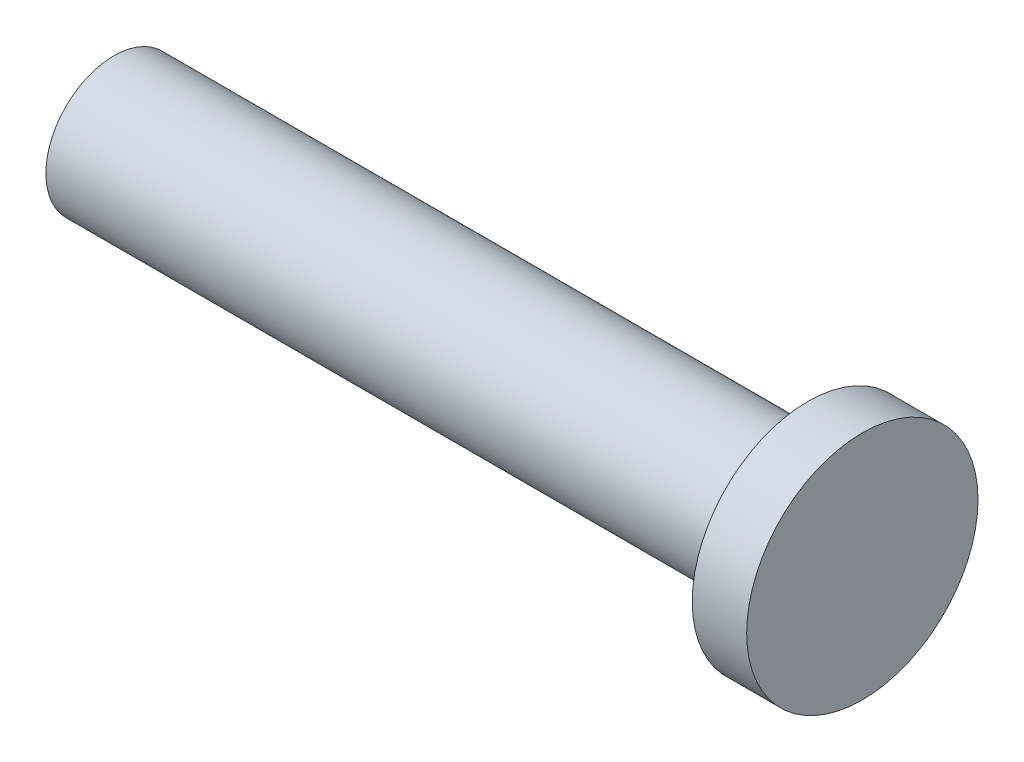
ISO-10303-21;
HEADER;
FILE_DESCRIPTION(('STEP AP214'),'2;1');
FILE_NAME('part.step','',(''),(''),'','','');
FILE_SCHEMA(('AUTOMOTIVE_DESIGN { 1 0 10303 214 1 1 1 1 }'));
ENDSEC;
DATA;
#1=APPLICATION_CONTEXT('core data for automotive mechanical design processes');
#2=APPLICATION_PROTOCOL_DEFINITION('international standard','automotive_design',2000,#1);
#3=PRODUCT_CONTEXT('',#1,'mechanical');
#4=PRODUCT('Part','Part','',(#3));
#5=PRODUCT_RELATED_PRODUCT_CATEGORY('part','',(#4));
#6=PRODUCT_DEFINITION_FORMATION('','',#4);
#7=PRODUCT_DEFINITION_CONTEXT('part definition',#1,'design');
#8=PRODUCT_DEFINITION('design','',#6,#7);
#9=PRODUCT_DEFINITION_SHAPE('','',#8);
#10=(LENGTH_UNIT() NAMED_UNIT(*) SI_UNIT(.MILLI.,.METRE.));
#11=(NAMED_UNIT(*) PLANE_ANGLE_UNIT() SI_UNIT($,.RADIAN.));
#12=(NAMED_UNIT(*) SI_UNIT($,.STERADIAN.) SOLID_ANGLE_UNIT());
#13=UNCERTAINTY_MEASURE_WITH_UNIT(LENGTH_MEASURE(1.E-05),#10,'distance_accuracy_value','');
#14=(GEOMETRIC_REPRESENTATION_CONTEXT(3) GLOBAL_UNCERTAINTY_ASSIGNED_CONTEXT((#13)) GLOBAL_UNIT_ASSIGNED_CONTEXT((#10,
#11,#12)) REPRESENTATION_CONTEXT('',''));
#15=CARTESIAN_POINT('',(0.,0.,0.));
#16=DIRECTION('',(0.,0.,1.));
#17=DIRECTION('',(1.,0.,0.));
#18=AXIS2_PLACEMENT_3D('',#15,#16,#17);
#19=CARTESIAN_POINT('',(33.6046195652174,0.,0.));
#20=DIRECTION('',(-1.,0.,0.));
#21=DIRECTION('',(0.,0.,1.));
#22=AXIS2_PLACEMENT_3D('',#19,#20,#21);
#23=CYLINDRICAL_SURFACE('',#22,3.75);
#24=CARTESIAN_POINT('',(-7.64538043478261,0.,0.));
#25=DIRECTION('',(1.,0.,0.));
#26=DIRECTION('',(0.,0.,-1.));
#27=AXIS2_PLACEMENT_3D('',#24,#25,#26);
#28=CIRCLE('',#27,3.75);
#29=CARTESIAN_POINT('',(-7.64538043478261,0.,-3.75));
#30=VERTEX_POINT('',#29);
#31=EDGE_CURVE('E38',#30,#30,#28,.T.);
#32=ORIENTED_EDGE('',*,*,#31,.T.);
#33=EDGE_LOOP('',(#32));
#34=FACE_BOUND('',#33,.T.);
#35=CARTESIAN_POINT('',(30.6046195652174,0.,0.));
#36=DIRECTION('',(1.,0.,0.));
#37=DIRECTION('',(0.,0.,-1.));
#38=AXIS2_PLACEMENT_3D('',#35,#36,#37);
#39=CIRCLE('',#38,3.75);
#40=CARTESIAN_POINT('',(30.6046195652174,0.,-3.75));
#41=VERTEX_POINT('',#40);
#42=EDGE_CURVE('E10',#41,#41,#39,.T.);
#43=ORIENTED_EDGE('',*,*,#42,.F.);
#44=EDGE_LOOP('',(#43));
#45=FACE_BOUND('',#44,.T.);
#46=ADVANCED_FACE('F32',(#34,#45),#23,.T.);
#47=CARTESIAN_POINT('',(-7.64538043478261,0.,0.));
#48=DIRECTION('',(1.,0.,0.));
#49=DIRECTION('',(0.,0.,-1.));
#50=AXIS2_PLACEMENT_3D('',#47,#48,#49);
#51=PLANE('',#50);
#52=ORIENTED_EDGE('',*,*,#31,.F.);
#53=EDGE_LOOP('',(#52));
#54=FACE_BOUND('',#53,.T.);
#55=ADVANCED_FACE('F57',(#54),#51,.F.);
#56=CARTESIAN_POINT('',(30.6046195652174,0.,0.));
#57=DIRECTION('',(1.,0.,0.));
#58=DIRECTION('',(0.,0.,-1.));
#59=AXIS2_PLACEMENT_3D('',#56,#57,#58);
#60=CYLINDRICAL_SURFACE('',#59,6.375);
#61=CARTESIAN_POINT('',(30.6046195652174,0.,0.));
#62=DIRECTION('',(1.,0.,0.));
#63=DIRECTION('',(0.,0.,-1.));
#64=AXIS2_PLACEMENT_3D('',#61,#62,#63);
#65=CIRCLE('',#64,6.375);
#66=CARTESIAN_POINT('',(30.6046195652174,0.,-6.375));
#67=VERTEX_POINT('',#66);
#68=EDGE_CURVE('E42',#67,#67,#65,.T.);
#69=ORIENTED_EDGE('',*,*,#68,.T.);
#70=EDGE_LOOP('',(#69));
#71=FACE_BOUND('',#70,.T.);
#72=CARTESIAN_POINT('',(33.6046195652174,0.,0.));
#73=DIRECTION('',(1.,0.,0.));
#74=DIRECTION('',(0.,0.,-1.));
#75=AXIS2_PLACEMENT_3D('',#72,#73,#74);
#76=CIRCLE('',#75,6.375);
#77=CARTESIAN_POINT('',(33.6046195652174,0.,-6.375));
#78=VERTEX_POINT('',#77);
#79=EDGE_CURVE('E46',#78,#78,#76,.T.);
#80=ORIENTED_EDGE('',*,*,#79,.F.);
#81=EDGE_LOOP('',(#80));
#82=FACE_BOUND('',#81,.T.);
#83=ADVANCED_FACE('F54',(#71,#82),#60,.T.);
#84=CARTESIAN_POINT('',(30.6046195652174,0.,0.));
#85=DIRECTION('',(1.,0.,0.));
#86=DIRECTION('',(0.,0.,-1.));
#87=AXIS2_PLACEMENT_3D('',#84,#85,#86);
#88=PLANE('',#87);
#89=ORIENTED_EDGE('',*,*,#42,.T.);
#90=EDGE_LOOP('',(#89));
#91=FACE_BOUND('',#90,.T.);
#92=ORIENTED_EDGE('',*,*,#68,.F.);
#93=EDGE_LOOP('',(#92));
#94=FACE_BOUND('',#93,.T.);
#95=ADVANCED_FACE('F56',(#91,#94),#88,.F.);
#96=CARTESIAN_POINT('',(33.6046195652174,0.,0.));
#97=DIRECTION('',(1.,0.,0.));
#98=DIRECTION('',(0.,0.,-1.));
#99=AXIS2_PLACEMENT_3D('',#96,#97,#98);
#100=PLANE('',#99);
#101=ORIENTED_EDGE('',*,*,#79,.T.);
#102=EDGE_LOOP('',(#101));
#103=FACE_BOUND('',#102,.T.);
#104=ADVANCED_FACE('F52',(#103),#100,.T.);
#105=CLOSED_SHELL('',(#46,#55,#83,#95,#104));
#106=MANIFOLD_SOLID_BREP('B2',#105);
#107=ADVANCED_BREP_SHAPE_REPRESENTATION('',(#18,#106),#14);
#108=SHAPE_DEFINITION_REPRESENTATION(#9,#107);
ENDSEC;
END-ISO-10303-21;
